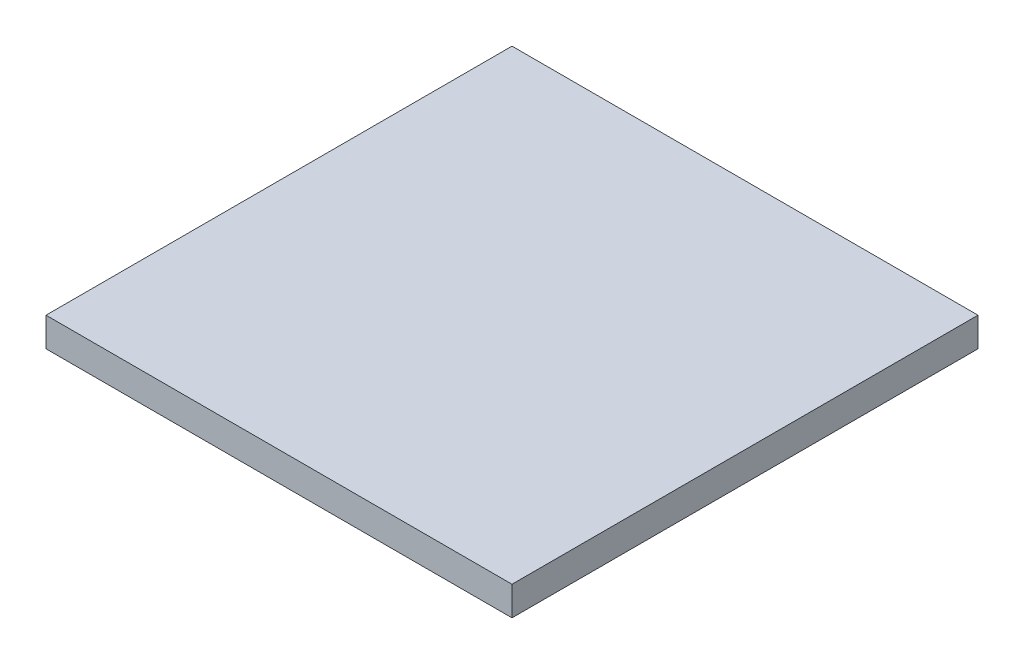
ISO-10303-21;
HEADER;
FILE_DESCRIPTION(('STEP AP214'),'2;1');
FILE_NAME('part.step','',(''),(''),'','','');
FILE_SCHEMA(('AUTOMOTIVE_DESIGN { 1 0 10303 214 1 1 1 1 }'));
ENDSEC;
DATA;
#1=APPLICATION_CONTEXT('core data for automotive mechanical design processes');
#2=APPLICATION_PROTOCOL_DEFINITION('international standard','automotive_design',2000,#1);
#3=PRODUCT_CONTEXT('',#1,'mechanical');
#4=PRODUCT('Part','Part','',(#3));
#5=PRODUCT_RELATED_PRODUCT_CATEGORY('part','',(#4));
#6=PRODUCT_DEFINITION_FORMATION('','',#4);
#7=PRODUCT_DEFINITION_CONTEXT('part definition',#1,'design');
#8=PRODUCT_DEFINITION('design','',#6,#7);
#9=PRODUCT_DEFINITION_SHAPE('','',#8);
#10=(LENGTH_UNIT() NAMED_UNIT(*) SI_UNIT(.MILLI.,.METRE.));
#11=(NAMED_UNIT(*) PLANE_ANGLE_UNIT() SI_UNIT($,.RADIAN.));
#12=(NAMED_UNIT(*) SI_UNIT($,.STERADIAN.) SOLID_ANGLE_UNIT());
#13=UNCERTAINTY_MEASURE_WITH_UNIT(LENGTH_MEASURE(1.E-05),#10,'distance_accuracy_value','');
#14=(GEOMETRIC_REPRESENTATION_CONTEXT(3) GLOBAL_UNCERTAINTY_ASSIGNED_CONTEXT((#13)) GLOBAL_UNIT_ASSIGNED_CONTEXT((#10,
#11,#12)) REPRESENTATION_CONTEXT('',''));
#15=CARTESIAN_POINT('',(0.,0.,0.));
#16=DIRECTION('',(0.,0.,1.));
#17=DIRECTION('',(1.,0.,0.));
#18=AXIS2_PLACEMENT_3D('',#15,#16,#17);
#19=CARTESIAN_POINT('',(0.,0.,0.));
#20=DIRECTION('',(0.,1.,0.));
#21=DIRECTION('',(0.,0.,1.));
#22=AXIS2_PLACEMENT_3D('',#19,#20,#21);
#23=PLANE('',#22);
#24=DIRECTION('',(0.,0.,1.));
#25=VECTOR('',#24,1.);
#26=CARTESIAN_POINT('',(-4.88607505411878,0.,-15.7591558916943));
#27=LINE('',#26,#25);
#28=CARTESIAN_POINT('',(-4.88607505411878,0.,-25.4111558916943));
#29=VERTEX_POINT('',#28);
#30=CARTESIAN_POINT('',(-4.88607505411878,0.,-15.7591558916943));
#31=VERTEX_POINT('',#30);
#32=EDGE_CURVE('E189',#29,#31,#27,.T.);
#33=ORIENTED_EDGE('',*,*,#32,.F.);
#34=DIRECTION('',(-1.,0.,0.));
#35=VECTOR('',#34,1.);
#36=CARTESIAN_POINT('',(0.752724945881224,0.,-25.4111558916943));
#37=LINE('',#36,#35);
#38=CARTESIAN_POINT('',(0.752724945881224,0.,-25.4111558916943));
#39=VERTEX_POINT('',#38);
#40=EDGE_CURVE('E153',#39,#29,#37,.T.);
#41=ORIENTED_EDGE('',*,*,#40,.F.);
#42=DIRECTION('',(0.,0.,-1.));
#43=VECTOR('',#42,1.);
#44=CARTESIAN_POINT('',(0.752724945881224,0.,-0.0111558916943231));
#45=LINE('',#44,#43);
#46=CARTESIAN_POINT('',(0.752724945881224,0.,-0.0111558916943231));
#47=VERTEX_POINT('',#46);
#48=EDGE_CURVE('E133',#47,#39,#45,.T.);
#49=ORIENTED_EDGE('',*,*,#48,.F.);
#50=DIRECTION('',(1.,0.,0.));
#51=VECTOR('',#50,1.);
#52=CARTESIAN_POINT('',(0.752724945881224,0.,-0.0111558916943231));
#53=LINE('',#52,#51);
#54=CARTESIAN_POINT('',(-24.6472750541188,0.,-0.01115589169432));
#55=VERTEX_POINT('',#54);
#56=EDGE_CURVE('E146',#55,#47,#53,.T.);
#57=ORIENTED_EDGE('',*,*,#56,.F.);
#58=DIRECTION('',(0.,0.,1.));
#59=VECTOR('',#58,1.);
#60=CARTESIAN_POINT('',(-24.6472750541188,0.,-0.01115589169432));
#61=LINE('',#60,#59);
#62=CARTESIAN_POINT('',(-24.6472750541188,0.,-25.4111558916943));
#63=VERTEX_POINT('',#62);
#64=EDGE_CURVE('E156',#63,#55,#61,.T.);
#65=ORIENTED_EDGE('',*,*,#64,.F.);
#66=CARTESIAN_POINT('',(-19.0084750541188,0.,-25.4111558916943));
#67=VERTEX_POINT('',#66);
#68=EDGE_CURVE('E136',#67,#63,#37,.T.);
#69=ORIENTED_EDGE('',*,*,#68,.F.);
#70=DIRECTION('',(0.,0.,-1.));
#71=VECTOR('',#70,1.);
#72=CARTESIAN_POINT('',(-19.0084750541188,0.,-25.4111558916943));
#73=LINE('',#72,#71);
#74=CARTESIAN_POINT('',(-19.0084750541188,0.,-15.7591558916943));
#75=VERTEX_POINT('',#74);
#76=EDGE_CURVE('E203',#75,#67,#73,.T.);
#77=ORIENTED_EDGE('',*,*,#76,.F.);
#78=DIRECTION('',(-0.326673503876224,0.,-0.945137250279149));
#79=VECTOR('',#78,1.);
#80=CARTESIAN_POINT('',(-19.0084750541188,0.,-15.7591558916943));
#81=LINE('',#80,#79);
#82=CARTESIAN_POINT('',(-17.9549763802271,0.,-12.7111558916943));
#83=VERTEX_POINT('',#82);
#84=EDGE_CURVE('E132',#83,#75,#81,.T.);
#85=ORIENTED_EDGE('',*,*,#84,.F.);
#86=DIRECTION('',(-1.,0.,0.));
#87=VECTOR('',#86,1.);
#88=CARTESIAN_POINT('',(-17.9549763802271,0.,-12.7111558916943));
#89=LINE('',#88,#87);
#90=CARTESIAN_POINT('',(-5.93957372801048,0.,-12.7111558916943));
#91=VERTEX_POINT('',#90);
#92=EDGE_CURVE('E54',#91,#83,#89,.T.);
#93=ORIENTED_EDGE('',*,*,#92,.F.);
#94=DIRECTION('',(-0.326673503876224,0.,0.945137250279149));
#95=VECTOR('',#94,1.);
#96=CARTESIAN_POINT('',(-5.93957372801048,0.,-12.7111558916943));
#97=LINE('',#96,#95);
#98=EDGE_CURVE('E49',#31,#91,#97,.T.);
#99=ORIENTED_EDGE('',*,*,#98,.F.);
#100=EDGE_LOOP('',(#33,#41,#49,#57,#65,#69,#77,#85,#93,#99));
#101=FACE_BOUND('',#100,.T.);
#102=ADVANCED_FACE('F34',(#101),#23,.F.);
#103=CARTESIAN_POINT('',(0.752724945881224,1.5875,-0.0111558916943231));
#104=DIRECTION('',(-1.,0.,0.));
#105=DIRECTION('',(0.,0.,1.));
#106=AXIS2_PLACEMENT_3D('',#103,#104,#105);
#107=PLANE('',#106);
#108=ORIENTED_EDGE('',*,*,#48,.T.);
#109=DIRECTION('',(0.,-1.,0.));
#110=VECTOR('',#109,1.);
#111=CARTESIAN_POINT('',(0.752724945881224,1.5875,-25.4111558916943));
#112=LINE('',#111,#110);
#113=CARTESIAN_POINT('',(0.752724945881224,1.5875,-25.4111558916943));
#114=VERTEX_POINT('',#113);
#115=EDGE_CURVE('E11',#114,#39,#112,.T.);
#116=ORIENTED_EDGE('',*,*,#115,.F.);
#117=DIRECTION('',(0.,0.,-1.));
#118=VECTOR('',#117,1.);
#119=CARTESIAN_POINT('',(0.752724945881224,1.5875,-0.0111558916943231));
#120=LINE('',#119,#118);
#121=CARTESIAN_POINT('',(0.752724945881224,1.5875,-0.0111558916943231));
#122=VERTEX_POINT('',#121);
#123=EDGE_CURVE('E142',#122,#114,#120,.T.);
#124=ORIENTED_EDGE('',*,*,#123,.F.);
#125=DIRECTION('',(0.,-1.,0.));
#126=VECTOR('',#125,1.);
#127=CARTESIAN_POINT('',(0.752724945881224,1.5875,-0.0111558916943231));
#128=LINE('',#127,#126);
#129=EDGE_CURVE('E151',#122,#47,#128,.T.);
#130=ORIENTED_EDGE('',*,*,#129,.T.);
#131=EDGE_LOOP('',(#108,#116,#124,#130));
#132=FACE_BOUND('',#131,.T.);
#133=ADVANCED_FACE('F36',(#132),#107,.F.);
#134=CARTESIAN_POINT('',(0.752724945881224,1.5875,-25.4111558916943));
#135=DIRECTION('',(0.,0.,1.));
#136=DIRECTION('',(1.,0.,0.));
#137=AXIS2_PLACEMENT_3D('',#134,#135,#136);
#138=PLANE('',#137);
#139=ORIENTED_EDGE('',*,*,#40,.T.);
#140=DIRECTION('',(0.,1.,0.));
#141=VECTOR('',#140,1.);
#142=CARTESIAN_POINT('',(-4.88607505411878,-3.302,-25.4111558916943));
#143=LINE('',#142,#141);
#144=CARTESIAN_POINT('',(-4.88607505411878,-3.302,-25.4111558916943));
#145=VERTEX_POINT('',#144);
#146=EDGE_CURVE('E138',#145,#29,#143,.T.);
#147=ORIENTED_EDGE('',*,*,#146,.F.);
#148=DIRECTION('',(1.,0.,0.));
#149=VECTOR('',#148,1.);
#150=CARTESIAN_POINT('',(-4.88607505411878,-3.302,-25.4111558916943));
#151=LINE('',#150,#149);
#152=CARTESIAN_POINT('',(-19.0084750541188,-3.302,-25.4111558916943));
#153=VERTEX_POINT('',#152);
#154=EDGE_CURVE('E120',#153,#145,#151,.T.);
#155=ORIENTED_EDGE('',*,*,#154,.F.);
#156=DIRECTION('',(0.,1.,0.));
#157=VECTOR('',#156,1.);
#158=CARTESIAN_POINT('',(-19.0084750541188,-3.302,-25.4111558916943));
#159=LINE('',#158,#157);
#160=EDGE_CURVE('E117',#153,#67,#159,.T.);
#161=ORIENTED_EDGE('',*,*,#160,.T.);
#162=ORIENTED_EDGE('',*,*,#68,.T.);
#163=DIRECTION('',(0.,-1.,0.));
#164=VECTOR('',#163,1.);
#165=CARTESIAN_POINT('',(-24.6472750541188,1.5875,-25.4111558916943));
#166=LINE('',#165,#164);
#167=CARTESIAN_POINT('',(-24.6472750541188,1.5875,-25.4111558916943));
#168=VERTEX_POINT('',#167);
#169=EDGE_CURVE('E42',#168,#63,#166,.T.);
#170=ORIENTED_EDGE('',*,*,#169,.F.);
#171=DIRECTION('',(-1.,0.,0.));
#172=VECTOR('',#171,1.);
#173=CARTESIAN_POINT('',(0.752724945881224,1.5875,-25.4111558916943));
#174=LINE('',#173,#172);
#175=EDGE_CURVE('E145',#114,#168,#174,.T.);
#176=ORIENTED_EDGE('',*,*,#175,.F.);
#177=ORIENTED_EDGE('',*,*,#115,.T.);
#178=EDGE_LOOP('',(#139,#147,#155,#161,#162,#170,#176,#177));
#179=FACE_BOUND('',#178,.T.);
#180=ADVANCED_FACE('F182',(#179),#138,.F.);
#181=CARTESIAN_POINT('',(-24.6472750541188,1.5875,-0.01115589169432));
#182=DIRECTION('',(1.,0.,0.));
#183=DIRECTION('',(0.,0.,-1.));
#184=AXIS2_PLACEMENT_3D('',#181,#182,#183);
#185=PLANE('',#184);
#186=ORIENTED_EDGE('',*,*,#64,.T.);
#187=DIRECTION('',(0.,-1.,0.));
#188=VECTOR('',#187,1.);
#189=CARTESIAN_POINT('',(-24.6472750541188,1.5875,-0.01115589169432));
#190=LINE('',#189,#188);
#191=CARTESIAN_POINT('',(-24.6472750541188,1.5875,-0.01115589169432));
#192=VERTEX_POINT('',#191);
#193=EDGE_CURVE('E161',#192,#55,#190,.T.);
#194=ORIENTED_EDGE('',*,*,#193,.F.);
#195=DIRECTION('',(0.,0.,1.));
#196=VECTOR('',#195,1.);
#197=CARTESIAN_POINT('',(-24.6472750541188,1.5875,-0.01115589169432));
#198=LINE('',#197,#196);
#199=EDGE_CURVE('E148',#168,#192,#198,.T.);
#200=ORIENTED_EDGE('',*,*,#199,.F.);
#201=ORIENTED_EDGE('',*,*,#169,.T.);
#202=EDGE_LOOP('',(#186,#194,#200,#201));
#203=FACE_BOUND('',#202,.T.);
#204=ADVANCED_FACE('F168',(#203),#185,.F.);
#205=CARTESIAN_POINT('',(0.752724945881224,1.5875,-0.0111558916943231));
#206=DIRECTION('',(0.,0.,-1.));
#207=DIRECTION('',(-1.,0.,0.));
#208=AXIS2_PLACEMENT_3D('',#205,#206,#207);
#209=PLANE('',#208);
#210=ORIENTED_EDGE('',*,*,#56,.T.);
#211=ORIENTED_EDGE('',*,*,#129,.F.);
#212=DIRECTION('',(1.,0.,0.));
#213=VECTOR('',#212,1.);
#214=CARTESIAN_POINT('',(0.752724945881224,1.5875,-0.0111558916943231));
#215=LINE('',#214,#213);
#216=EDGE_CURVE('E150',#192,#122,#215,.T.);
#217=ORIENTED_EDGE('',*,*,#216,.F.);
#218=ORIENTED_EDGE('',*,*,#193,.T.);
#219=EDGE_LOOP('',(#210,#211,#217,#218));
#220=FACE_BOUND('',#219,.T.);
#221=ADVANCED_FACE('F175',(#220),#209,.F.);
#222=CARTESIAN_POINT('',(0.,1.5875,0.));
#223=DIRECTION('',(0.,1.,0.));
#224=DIRECTION('',(0.,0.,1.));
#225=AXIS2_PLACEMENT_3D('',#222,#223,#224);
#226=PLANE('',#225);
#227=ORIENTED_EDGE('',*,*,#123,.T.);
#228=ORIENTED_EDGE('',*,*,#175,.T.);
#229=ORIENTED_EDGE('',*,*,#199,.T.);
#230=ORIENTED_EDGE('',*,*,#216,.T.);
#231=EDGE_LOOP('',(#227,#228,#229,#230));
#232=FACE_BOUND('',#231,.T.);
#233=ADVANCED_FACE('F181',(#232),#226,.T.);
#234=CARTESIAN_POINT('',(-19.0084750541188,-3.302,-15.7591558916943));
#235=DIRECTION('',(0.945137250279149,0.,-0.326673503876224));
#236=DIRECTION('',(-0.326673503876224,0.,-0.945137250279149));
#237=AXIS2_PLACEMENT_3D('',#234,#235,#236);
#238=PLANE('',#237);
#239=ORIENTED_EDGE('',*,*,#84,.T.);
#240=DIRECTION('',(0.,1.,0.));
#241=VECTOR('',#240,1.);
#242=CARTESIAN_POINT('',(-19.0084750541188,-3.302,-15.7591558916943));
#243=LINE('',#242,#241);
#244=CARTESIAN_POINT('',(-19.0084750541188,-3.302,-15.7591558916943));
#245=VERTEX_POINT('',#244);
#246=EDGE_CURVE('E114',#245,#75,#243,.T.);
#247=ORIENTED_EDGE('',*,*,#246,.F.);
#248=DIRECTION('',(-0.326673503876224,0.,-0.945137250279149));
#249=VECTOR('',#248,1.);
#250=CARTESIAN_POINT('',(-19.0084750541188,-3.302,-15.7591558916943));
#251=LINE('',#250,#249);
#252=CARTESIAN_POINT('',(-17.9549763802271,-3.302,-12.7111558916943));
#253=VERTEX_POINT('',#252);
#254=EDGE_CURVE('E121',#253,#245,#251,.T.);
#255=ORIENTED_EDGE('',*,*,#254,.F.);
#256=DIRECTION('',(0.,1.,0.));
#257=VECTOR('',#256,1.);
#258=CARTESIAN_POINT('',(-17.9549763802271,-3.302,-12.7111558916943));
#259=LINE('',#258,#257);
#260=EDGE_CURVE('E198',#253,#83,#259,.T.);
#261=ORIENTED_EDGE('',*,*,#260,.T.);
#262=EDGE_LOOP('',(#239,#247,#255,#261));
#263=FACE_BOUND('',#262,.T.);
#264=ADVANCED_FACE('F131',(#263),#238,.F.);
#265=CARTESIAN_POINT('',(-19.0084750541188,-3.302,-25.4111558916943));
#266=DIRECTION('',(1.,0.,0.));
#267=DIRECTION('',(0.,0.,-1.));
#268=AXIS2_PLACEMENT_3D('',#265,#266,#267);
#269=PLANE('',#268);
#270=ORIENTED_EDGE('',*,*,#76,.T.);
#271=ORIENTED_EDGE('',*,*,#160,.F.);
#272=DIRECTION('',(0.,0.,-1.));
#273=VECTOR('',#272,1.);
#274=CARTESIAN_POINT('',(-19.0084750541188,-3.302,-25.4111558916943));
#275=LINE('',#274,#273);
#276=EDGE_CURVE('E109',#245,#153,#275,.T.);
#277=ORIENTED_EDGE('',*,*,#276,.F.);
#278=ORIENTED_EDGE('',*,*,#246,.T.);
#279=EDGE_LOOP('',(#270,#271,#277,#278));
#280=FACE_BOUND('',#279,.T.);
#281=ADVANCED_FACE('F112',(#280),#269,.F.);
#282=CARTESIAN_POINT('',(-4.88607505411878,-3.302,-15.7591558916943));
#283=DIRECTION('',(-1.,0.,0.));
#284=DIRECTION('',(0.,0.,1.));
#285=AXIS2_PLACEMENT_3D('',#282,#283,#284);
#286=PLANE('',#285);
#287=ORIENTED_EDGE('',*,*,#32,.T.);
#288=DIRECTION('',(0.,1.,0.));
#289=VECTOR('',#288,1.);
#290=CARTESIAN_POINT('',(-4.88607505411878,-3.302,-15.7591558916943));
#291=LINE('',#290,#289);
#292=CARTESIAN_POINT('',(-4.88607505411878,-3.302,-15.7591558916943));
#293=VERTEX_POINT('',#292);
#294=EDGE_CURVE('E192',#293,#31,#291,.T.);
#295=ORIENTED_EDGE('',*,*,#294,.F.);
#296=DIRECTION('',(0.,0.,1.));
#297=VECTOR('',#296,1.);
#298=CARTESIAN_POINT('',(-4.88607505411878,-3.302,-15.7591558916943));
#299=LINE('',#298,#297);
#300=EDGE_CURVE('E191',#145,#293,#299,.T.);
#301=ORIENTED_EDGE('',*,*,#300,.F.);
#302=ORIENTED_EDGE('',*,*,#146,.T.);
#303=EDGE_LOOP('',(#287,#295,#301,#302));
#304=FACE_BOUND('',#303,.T.);
#305=ADVANCED_FACE('F187',(#304),#286,.F.);
#306=CARTESIAN_POINT('',(-5.93957372801048,-3.302,-12.7111558916943));
#307=DIRECTION('',(-0.945137250279149,0.,-0.326673503876224));
#308=DIRECTION('',(-0.326673503876224,0.,0.945137250279149));
#309=AXIS2_PLACEMENT_3D('',#306,#307,#308);
#310=PLANE('',#309);
#311=ORIENTED_EDGE('',*,*,#98,.T.);
#312=DIRECTION('',(0.,1.,0.));
#313=VECTOR('',#312,1.);
#314=CARTESIAN_POINT('',(-5.93957372801048,-3.302,-12.7111558916943));
#315=LINE('',#314,#313);
#316=CARTESIAN_POINT('',(-5.93957372801048,-3.302,-12.7111558916943));
#317=VERTEX_POINT('',#316);
#318=EDGE_CURVE('E193',#317,#91,#315,.T.);
#319=ORIENTED_EDGE('',*,*,#318,.F.);
#320=DIRECTION('',(-0.326673503876224,0.,0.945137250279149));
#321=VECTOR('',#320,1.);
#322=CARTESIAN_POINT('',(-5.93957372801048,-3.302,-12.7111558916943));
#323=LINE('',#322,#321);
#324=EDGE_CURVE('E207',#293,#317,#323,.T.);
#325=ORIENTED_EDGE('',*,*,#324,.F.);
#326=ORIENTED_EDGE('',*,*,#294,.T.);
#327=EDGE_LOOP('',(#311,#319,#325,#326));
#328=FACE_BOUND('',#327,.T.);
#329=ADVANCED_FACE('F213',(#328),#310,.F.);
#330=CARTESIAN_POINT('',(-17.9549763802271,-3.302,-12.7111558916943));
#331=DIRECTION('',(0.,0.,-1.));
#332=DIRECTION('',(-1.,0.,0.));
#333=AXIS2_PLACEMENT_3D('',#330,#331,#332);
#334=PLANE('',#333);
#335=ORIENTED_EDGE('',*,*,#92,.T.);
#336=ORIENTED_EDGE('',*,*,#260,.F.);
#337=DIRECTION('',(-1.,0.,0.));
#338=VECTOR('',#337,1.);
#339=CARTESIAN_POINT('',(-17.9549763802271,-3.302,-12.7111558916943));
#340=LINE('',#339,#338);
#341=EDGE_CURVE('E126',#317,#253,#340,.T.);
#342=ORIENTED_EDGE('',*,*,#341,.F.);
#343=ORIENTED_EDGE('',*,*,#318,.T.);
#344=EDGE_LOOP('',(#335,#336,#342,#343));
#345=FACE_BOUND('',#344,.T.);
#346=ADVANCED_FACE('F215',(#345),#334,.F.);
#347=CARTESIAN_POINT('',(0.,-3.302,0.));
#348=DIRECTION('',(0.,1.,0.));
#349=DIRECTION('',(0.,0.,1.));
#350=AXIS2_PLACEMENT_3D('',#347,#348,#349);
#351=PLANE('',#350);
#352=ORIENTED_EDGE('',*,*,#254,.T.);
#353=ORIENTED_EDGE('',*,*,#276,.T.);
#354=ORIENTED_EDGE('',*,*,#154,.T.);
#355=ORIENTED_EDGE('',*,*,#300,.T.);
#356=ORIENTED_EDGE('',*,*,#324,.T.);
#357=ORIENTED_EDGE('',*,*,#341,.T.);
#358=EDGE_LOOP('',(#352,#353,#354,#355,#356,#357));
#359=FACE_BOUND('',#358,.T.);
#360=ADVANCED_FACE('F124',(#359),#351,.F.);
#361=CLOSED_SHELL('',(#102,#133,#180,#204,#221,#233,#264,#281,#305,#329,#346,#360));
#362=MANIFOLD_SOLID_BREP('B2',#361);
#363=ADVANCED_BREP_SHAPE_REPRESENTATION('',(#18,#362),#14);
#364=SHAPE_DEFINITION_REPRESENTATION(#9,#363);
ENDSEC;
END-ISO-10303-21;
